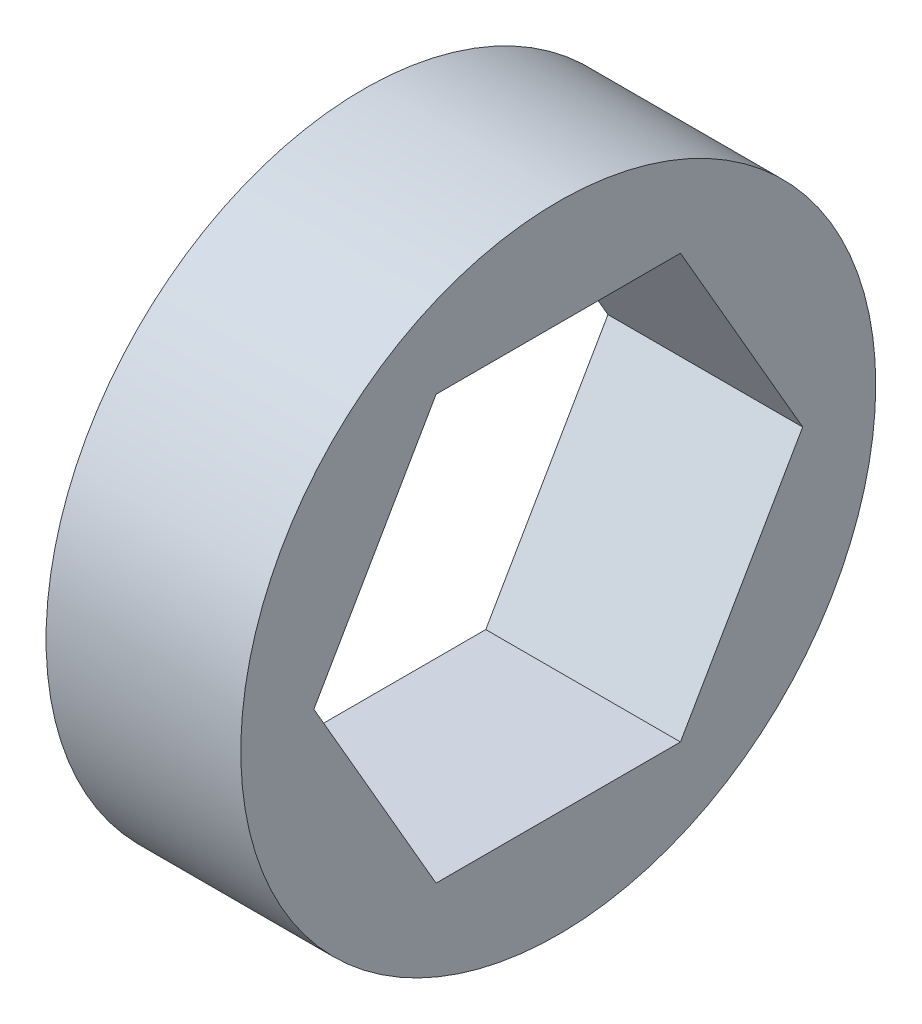
ISO-10303-21;
HEADER;
FILE_DESCRIPTION(('STEP AP214'),'2;1');
FILE_NAME('part.step','',(''),(''),'','','');
FILE_SCHEMA(('AUTOMOTIVE_DESIGN { 1 0 10303 214 1 1 1 1 }'));
ENDSEC;
DATA;
#1=APPLICATION_CONTEXT('core data for automotive mechanical design processes');
#2=APPLICATION_PROTOCOL_DEFINITION('international standard','automotive_design',2000,#1);
#3=PRODUCT_CONTEXT('',#1,'mechanical');
#4=PRODUCT('Part','Part','',(#3));
#5=PRODUCT_RELATED_PRODUCT_CATEGORY('part','',(#4));
#6=PRODUCT_DEFINITION_FORMATION('','',#4);
#7=PRODUCT_DEFINITION_CONTEXT('part definition',#1,'design');
#8=PRODUCT_DEFINITION('design','',#6,#7);
#9=PRODUCT_DEFINITION_SHAPE('','',#8);
#10=(LENGTH_UNIT() NAMED_UNIT(*) SI_UNIT(.MILLI.,.METRE.));
#11=(NAMED_UNIT(*) PLANE_ANGLE_UNIT() SI_UNIT($,.RADIAN.));
#12=(NAMED_UNIT(*) SI_UNIT($,.STERADIAN.) SOLID_ANGLE_UNIT());
#13=UNCERTAINTY_MEASURE_WITH_UNIT(LENGTH_MEASURE(1.E-05),#10,'distance_accuracy_value','');
#14=(GEOMETRIC_REPRESENTATION_CONTEXT(3) GLOBAL_UNCERTAINTY_ASSIGNED_CONTEXT((#13)) GLOBAL_UNIT_ASSIGNED_CONTEXT((#10,
#11,#12)) REPRESENTATION_CONTEXT('',''));
#15=CARTESIAN_POINT('',(0.,0.,0.));
#16=DIRECTION('',(0.,0.,1.));
#17=DIRECTION('',(1.,0.,0.));
#18=AXIS2_PLACEMENT_3D('',#15,#16,#17);
#19=CARTESIAN_POINT('',(5.842,0.,0.));
#20=DIRECTION('',(1.,0.,0.));
#21=DIRECTION('',(0.,0.,-1.));
#22=AXIS2_PLACEMENT_3D('',#19,#20,#21);
#23=PLANE('',#22);
#24=CARTESIAN_POINT('',(5.842,0.,0.));
#25=DIRECTION('',(1.,0.,0.));
#26=DIRECTION('',(0.,0.,-1.));
#27=AXIS2_PLACEMENT_3D('',#24,#25,#26);
#28=CIRCLE('',#27,9.525);
#29=CARTESIAN_POINT('',(5.842,0.,-9.525));
#30=VERTEX_POINT('',#29);
#31=EDGE_CURVE('E11',#30,#30,#28,.T.);
#32=ORIENTED_EDGE('',*,*,#31,.T.);
#33=EDGE_LOOP('',(#32));
#34=FACE_BOUND('',#33,.T.);
#35=DIRECTION('',(0.,0.866025403784438,0.500000000000001));
#36=VECTOR('',#35,1.);
#37=CARTESIAN_POINT('',(5.842,0.,-7.33234841870825));
#38=LINE('',#37,#36);
#39=CARTESIAN_POINT('',(5.842,0.,-7.33234841870825));
#40=VERTEX_POINT('',#39);
#41=CARTESIAN_POINT('',(5.842,6.35000000000001,-3.66617420935411));
#42=VERTEX_POINT('',#41);
#43=EDGE_CURVE('E100',#40,#42,#38,.T.);
#44=ORIENTED_EDGE('',*,*,#43,.F.);
#45=DIRECTION('',(0.,0.866025403784441,-0.499999999999995));
#46=VECTOR('',#45,1.);
#47=CARTESIAN_POINT('',(5.842,-6.34999999999996,-3.6661742093542));
#48=LINE('',#47,#46);
#49=CARTESIAN_POINT('',(5.842,-6.34999999999996,-3.6661742093542));
#50=VERTEX_POINT('',#49);
#51=EDGE_CURVE('E92',#50,#40,#48,.T.);
#52=ORIENTED_EDGE('',*,*,#51,.F.);
#53=DIRECTION('',(0.,0.,-1.));
#54=VECTOR('',#53,1.);
#55=CARTESIAN_POINT('',(5.842,-6.35000000000004,3.66617420935407));
#56=LINE('',#55,#54);
#57=CARTESIAN_POINT('',(5.842,-6.35000000000004,3.66617420935407));
#58=VERTEX_POINT('',#57);
#59=EDGE_CURVE('E120',#58,#50,#56,.T.);
#60=ORIENTED_EDGE('',*,*,#59,.F.);
#61=DIRECTION('',(0.,-0.866025403784435,-0.500000000000007));
#62=VECTOR('',#61,1.);
#63=CARTESIAN_POINT('',(5.842,0.,7.33234841870825));
#64=LINE('',#63,#62);
#65=CARTESIAN_POINT('',(5.842,0.,7.33234841870825));
#66=VERTEX_POINT('',#65);
#67=EDGE_CURVE('E118',#66,#58,#64,.T.);
#68=ORIENTED_EDGE('',*,*,#67,.F.);
#69=DIRECTION('',(0.,-0.866025403784442,0.499999999999995));
#70=VECTOR('',#69,1.);
#71=CARTESIAN_POINT('',(5.842,6.34999999999999,3.66617420935415));
#72=LINE('',#71,#70);
#73=CARTESIAN_POINT('',(5.842,6.34999999999999,3.66617420935415));
#74=VERTEX_POINT('',#73);
#75=EDGE_CURVE('E114',#74,#66,#72,.T.);
#76=ORIENTED_EDGE('',*,*,#75,.F.);
#77=DIRECTION('',(0.,0.,1.));
#78=VECTOR('',#77,1.);
#79=CARTESIAN_POINT('',(5.842,6.35000000000001,-3.66617420935411));
#80=LINE('',#79,#78);
#81=EDGE_CURVE('E112',#42,#74,#80,.T.);
#82=ORIENTED_EDGE('',*,*,#81,.F.);
#83=EDGE_LOOP('',(#44,#52,#60,#68,#76,#82));
#84=FACE_BOUND('',#83,.T.);
#85=ADVANCED_FACE('F39',(#34,#84),#23,.T.);
#86=CARTESIAN_POINT('',(0.,0.,0.));
#87=DIRECTION('',(1.,0.,0.));
#88=DIRECTION('',(0.,0.,-1.));
#89=AXIS2_PLACEMENT_3D('',#86,#87,#88);
#90=PLANE('',#89);
#91=CARTESIAN_POINT('',(0.,0.,0.));
#92=DIRECTION('',(1.,0.,0.));
#93=DIRECTION('',(0.,0.,-1.));
#94=AXIS2_PLACEMENT_3D('',#91,#92,#93);
#95=CIRCLE('',#94,9.525);
#96=CARTESIAN_POINT('',(0.,0.,-9.525));
#97=VERTEX_POINT('',#96);
#98=EDGE_CURVE('E43',#97,#97,#95,.T.);
#99=ORIENTED_EDGE('',*,*,#98,.F.);
#100=EDGE_LOOP('',(#99));
#101=FACE_BOUND('',#100,.T.);
#102=DIRECTION('',(0.,0.866025403784441,-0.499999999999995));
#103=VECTOR('',#102,1.);
#104=CARTESIAN_POINT('',(0.,-6.34999999999996,-3.6661742093542));
#105=LINE('',#104,#103);
#106=CARTESIAN_POINT('',(0.,-6.34999999999996,-3.6661742093542));
#107=VERTEX_POINT('',#106);
#108=CARTESIAN_POINT('',(0.,0.,-7.33234841870825));
#109=VERTEX_POINT('',#108);
#110=EDGE_CURVE('E62',#107,#109,#105,.T.);
#111=ORIENTED_EDGE('',*,*,#110,.T.);
#112=DIRECTION('',(0.,0.866025403784438,0.500000000000001));
#113=VECTOR('',#112,1.);
#114=CARTESIAN_POINT('',(0.,0.,-7.33234841870825));
#115=LINE('',#114,#113);
#116=CARTESIAN_POINT('',(0.,6.35000000000001,-3.66617420935411));
#117=VERTEX_POINT('',#116);
#118=EDGE_CURVE('E107',#109,#117,#115,.T.);
#119=ORIENTED_EDGE('',*,*,#118,.T.);
#120=DIRECTION('',(0.,0.,1.));
#121=VECTOR('',#120,1.);
#122=CARTESIAN_POINT('',(0.,6.35000000000001,-3.66617420935411));
#123=LINE('',#122,#121);
#124=CARTESIAN_POINT('',(0.,6.34999999999999,3.66617420935415));
#125=VERTEX_POINT('',#124);
#126=EDGE_CURVE('E124',#117,#125,#123,.T.);
#127=ORIENTED_EDGE('',*,*,#126,.T.);
#128=DIRECTION('',(0.,-0.866025403784442,0.499999999999995));
#129=VECTOR('',#128,1.);
#130=CARTESIAN_POINT('',(0.,6.34999999999999,3.66617420935415));
#131=LINE('',#130,#129);
#132=CARTESIAN_POINT('',(0.,0.,7.33234841870825));
#133=VERTEX_POINT('',#132);
#134=EDGE_CURVE('E127',#125,#133,#131,.T.);
#135=ORIENTED_EDGE('',*,*,#134,.T.);
#136=DIRECTION('',(0.,-0.866025403784435,-0.500000000000007));
#137=VECTOR('',#136,1.);
#138=CARTESIAN_POINT('',(0.,0.,7.33234841870825));
#139=LINE('',#138,#137);
#140=CARTESIAN_POINT('',(0.,-6.35000000000004,3.66617420935407));
#141=VERTEX_POINT('',#140);
#142=EDGE_CURVE('E130',#133,#141,#139,.T.);
#143=ORIENTED_EDGE('',*,*,#142,.T.);
#144=DIRECTION('',(0.,0.,-1.));
#145=VECTOR('',#144,1.);
#146=CARTESIAN_POINT('',(0.,-6.35000000000004,3.66617420935407));
#147=LINE('',#146,#145);
#148=EDGE_CURVE('E101',#141,#107,#147,.T.);
#149=ORIENTED_EDGE('',*,*,#148,.T.);
#150=EDGE_LOOP('',(#111,#119,#127,#135,#143,#149));
#151=FACE_BOUND('',#150,.T.);
#152=ADVANCED_FACE('F147',(#101,#151),#90,.F.);
#153=CARTESIAN_POINT('',(5.842,0.,0.));
#154=DIRECTION('',(-1.,0.,0.));
#155=DIRECTION('',(0.,0.,1.));
#156=AXIS2_PLACEMENT_3D('',#153,#154,#155);
#157=CYLINDRICAL_SURFACE('',#156,9.525);
#158=ORIENTED_EDGE('',*,*,#31,.F.);
#159=EDGE_LOOP('',(#158));
#160=FACE_BOUND('',#159,.T.);
#161=ORIENTED_EDGE('',*,*,#98,.T.);
#162=EDGE_LOOP('',(#161));
#163=FACE_BOUND('',#162,.T.);
#164=ADVANCED_FACE('F41',(#160,#163),#157,.T.);
#165=CARTESIAN_POINT('',(5.842,-6.34999999999996,-3.6661742093542));
#166=DIRECTION('',(0.,0.499999999999995,0.866025403784442));
#167=DIRECTION('',(0.,-0.866025403784441,0.499999999999995));
#168=AXIS2_PLACEMENT_3D('',#165,#166,#167);
#169=PLANE('',#168);
#170=ORIENTED_EDGE('',*,*,#110,.F.);
#171=DIRECTION('',(-1.,0.,0.));
#172=VECTOR('',#171,1.);
#173=CARTESIAN_POINT('',(5.842,-6.34999999999996,-3.6661742093542));
#174=LINE('',#173,#172);
#175=EDGE_CURVE('E96',#50,#107,#174,.T.);
#176=ORIENTED_EDGE('',*,*,#175,.F.);
#177=ORIENTED_EDGE('',*,*,#51,.T.);
#178=DIRECTION('',(-1.,0.,0.));
#179=VECTOR('',#178,1.);
#180=CARTESIAN_POINT('',(5.842,0.,-7.33234841870825));
#181=LINE('',#180,#179);
#182=EDGE_CURVE('E95',#40,#109,#181,.T.);
#183=ORIENTED_EDGE('',*,*,#182,.T.);
#184=EDGE_LOOP('',(#170,#176,#177,#183));
#185=FACE_BOUND('',#184,.T.);
#186=ADVANCED_FACE('F94',(#185),#169,.T.);
#187=CARTESIAN_POINT('',(5.842,0.,-7.33234841870825));
#188=DIRECTION('',(0.,-0.500000000000001,0.866025403784438));
#189=DIRECTION('',(0.,-0.866025403784438,-0.500000000000001));
#190=AXIS2_PLACEMENT_3D('',#187,#188,#189);
#191=PLANE('',#190);
#192=ORIENTED_EDGE('',*,*,#118,.F.);
#193=ORIENTED_EDGE('',*,*,#182,.F.);
#194=ORIENTED_EDGE('',*,*,#43,.T.);
#195=DIRECTION('',(-1.,0.,0.));
#196=VECTOR('',#195,1.);
#197=CARTESIAN_POINT('',(5.842,6.35000000000001,-3.66617420935411));
#198=LINE('',#197,#196);
#199=EDGE_CURVE('E108',#42,#117,#198,.T.);
#200=ORIENTED_EDGE('',*,*,#199,.T.);
#201=EDGE_LOOP('',(#192,#193,#194,#200));
#202=FACE_BOUND('',#201,.T.);
#203=ADVANCED_FACE('F104',(#202),#191,.T.);
#204=CARTESIAN_POINT('',(5.842,6.35000000000001,-3.66617420935411));
#205=DIRECTION('',(0.,-1.,0.));
#206=DIRECTION('',(0.,0.,-1.));
#207=AXIS2_PLACEMENT_3D('',#204,#205,#206);
#208=PLANE('',#207);
#209=ORIENTED_EDGE('',*,*,#126,.F.);
#210=ORIENTED_EDGE('',*,*,#199,.F.);
#211=ORIENTED_EDGE('',*,*,#81,.T.);
#212=DIRECTION('',(-1.,0.,0.));
#213=VECTOR('',#212,1.);
#214=CARTESIAN_POINT('',(5.842,6.34999999999999,3.66617420935415));
#215=LINE('',#214,#213);
#216=EDGE_CURVE('E139',#74,#125,#215,.T.);
#217=ORIENTED_EDGE('',*,*,#216,.T.);
#218=EDGE_LOOP('',(#209,#210,#211,#217));
#219=FACE_BOUND('',#218,.T.);
#220=ADVANCED_FACE('F143',(#219),#208,.T.);
#221=CARTESIAN_POINT('',(5.842,6.34999999999999,3.66617420935415));
#222=DIRECTION('',(0.,-0.499999999999995,-0.866025403784441));
#223=DIRECTION('',(0.,0.866025403784442,-0.499999999999995));
#224=AXIS2_PLACEMENT_3D('',#221,#222,#223);
#225=PLANE('',#224);
#226=ORIENTED_EDGE('',*,*,#134,.F.);
#227=ORIENTED_EDGE('',*,*,#216,.F.);
#228=ORIENTED_EDGE('',*,*,#75,.T.);
#229=DIRECTION('',(-1.,0.,0.));
#230=VECTOR('',#229,1.);
#231=CARTESIAN_POINT('',(5.842,0.,7.33234841870825));
#232=LINE('',#231,#230);
#233=EDGE_CURVE('E137',#66,#133,#232,.T.);
#234=ORIENTED_EDGE('',*,*,#233,.T.);
#235=EDGE_LOOP('',(#226,#227,#228,#234));
#236=FACE_BOUND('',#235,.T.);
#237=ADVANCED_FACE('F155',(#236),#225,.T.);
#238=CARTESIAN_POINT('',(5.842,0.,7.33234841870825));
#239=DIRECTION('',(0.,0.500000000000007,-0.866025403784435));
#240=DIRECTION('',(0.,0.866025403784435,0.500000000000007));
#241=AXIS2_PLACEMENT_3D('',#238,#239,#240);
#242=PLANE('',#241);
#243=ORIENTED_EDGE('',*,*,#142,.F.);
#244=ORIENTED_EDGE('',*,*,#233,.F.);
#245=ORIENTED_EDGE('',*,*,#67,.T.);
#246=DIRECTION('',(-1.,0.,0.));
#247=VECTOR('',#246,1.);
#248=CARTESIAN_POINT('',(5.842,-6.35000000000004,3.66617420935407));
#249=LINE('',#248,#247);
#250=EDGE_CURVE('E54',#58,#141,#249,.T.);
#251=ORIENTED_EDGE('',*,*,#250,.T.);
#252=EDGE_LOOP('',(#243,#244,#245,#251));
#253=FACE_BOUND('',#252,.T.);
#254=ADVANCED_FACE('F153',(#253),#242,.T.);
#255=CARTESIAN_POINT('',(5.842,-6.35000000000004,3.66617420935407));
#256=DIRECTION('',(0.,1.,0.));
#257=DIRECTION('',(0.,0.,1.));
#258=AXIS2_PLACEMENT_3D('',#255,#256,#257);
#259=PLANE('',#258);
#260=ORIENTED_EDGE('',*,*,#148,.F.);
#261=ORIENTED_EDGE('',*,*,#250,.F.);
#262=ORIENTED_EDGE('',*,*,#59,.T.);
#263=ORIENTED_EDGE('',*,*,#175,.T.);
#264=EDGE_LOOP('',(#260,#261,#262,#263));
#265=FACE_BOUND('',#264,.T.);
#266=ADVANCED_FACE('F149',(#265),#259,.T.);
#267=CLOSED_SHELL('',(#85,#152,#164,#186,#203,#220,#237,#254,#266));
#268=MANIFOLD_SOLID_BREP('B2',#267);
#269=ADVANCED_BREP_SHAPE_REPRESENTATION('',(#18,#268),#14);
#270=SHAPE_DEFINITION_REPRESENTATION(#9,#269);
ENDSEC;
END-ISO-10303-21;
